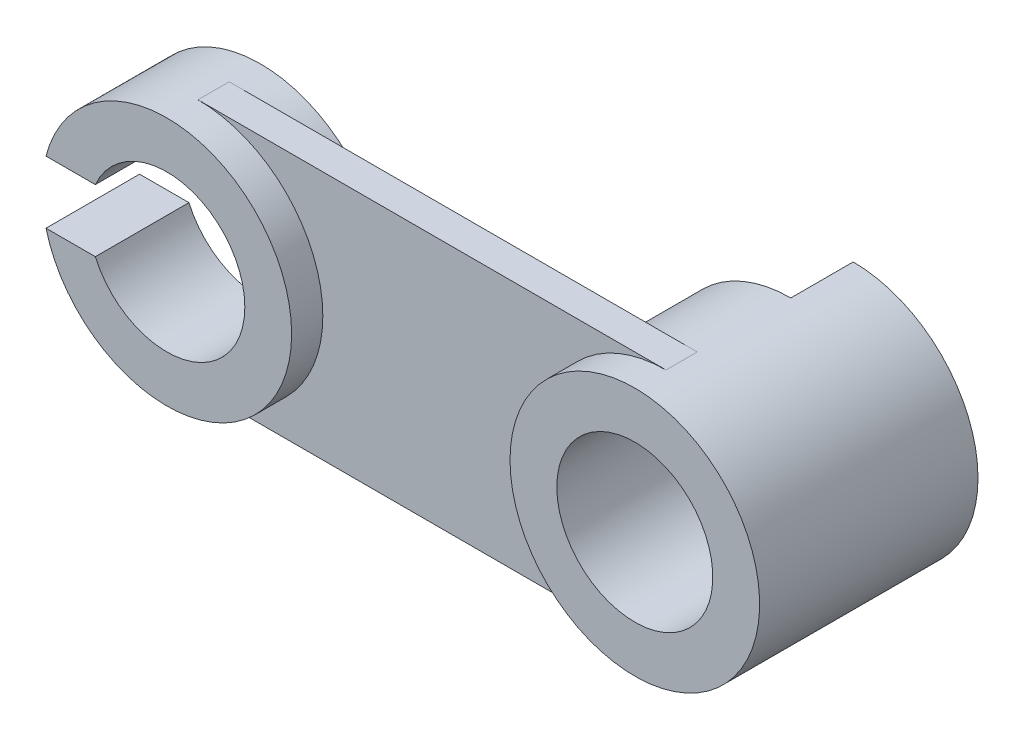
ISO-10303-21;
HEADER;
FILE_DESCRIPTION(('STEP AP214'),'2;1');
FILE_NAME('part.step','',(''),(''),'','','');
FILE_SCHEMA(('AUTOMOTIVE_DESIGN { 1 0 10303 214 1 1 1 1 }'));
ENDSEC;
DATA;
#1=APPLICATION_CONTEXT('core data for automotive mechanical design processes');
#2=APPLICATION_PROTOCOL_DEFINITION('international standard','automotive_design',2000,#1);
#3=PRODUCT_CONTEXT('',#1,'mechanical');
#4=PRODUCT('Part','Part','',(#3));
#5=PRODUCT_RELATED_PRODUCT_CATEGORY('part','',(#4));
#6=PRODUCT_DEFINITION_FORMATION('','',#4);
#7=PRODUCT_DEFINITION_CONTEXT('part definition',#1,'design');
#8=PRODUCT_DEFINITION('design','',#6,#7);
#9=PRODUCT_DEFINITION_SHAPE('','',#8);
#10=(LENGTH_UNIT() NAMED_UNIT(*) SI_UNIT(.MILLI.,.METRE.));
#11=(NAMED_UNIT(*) PLANE_ANGLE_UNIT() SI_UNIT($,.RADIAN.));
#12=(NAMED_UNIT(*) SI_UNIT($,.STERADIAN.) SOLID_ANGLE_UNIT());
#13=UNCERTAINTY_MEASURE_WITH_UNIT(LENGTH_MEASURE(1.E-05),#10,'distance_accuracy_value','');
#14=(GEOMETRIC_REPRESENTATION_CONTEXT(3) GLOBAL_UNCERTAINTY_ASSIGNED_CONTEXT((#13)) GLOBAL_UNIT_ASSIGNED_CONTEXT((#10,
#11,#12)) REPRESENTATION_CONTEXT('',''));
#15=CARTESIAN_POINT('',(0.,0.,0.));
#16=DIRECTION('',(0.,0.,1.));
#17=DIRECTION('',(1.,0.,0.));
#18=AXIS2_PLACEMENT_3D('',#15,#16,#17);
#19=CARTESIAN_POINT('',(17.5,2.5,-15.));
#20=DIRECTION('',(-1.,0.,0.));
#21=DIRECTION('',(0.,0.,1.));
#22=AXIS2_PLACEMENT_3D('',#19,#20,#21);
#23=PLANE('',#22);
#24=DIRECTION('',(0.,0.,-1.));
#25=VECTOR('',#24,1.);
#26=CARTESIAN_POINT('',(17.5,-2.5,-15.));
#27=LINE('',#26,#25);
#28=CARTESIAN_POINT('',(17.5,-2.5,0.));
#29=VERTEX_POINT('',#28);
#30=CARTESIAN_POINT('',(17.5,-2.5,-15.));
#31=VERTEX_POINT('',#30);
#32=EDGE_CURVE('E90',#29,#31,#27,.T.);
#33=ORIENTED_EDGE('',*,*,#32,.T.);
#34=DIRECTION('',(0.,-1.,0.));
#35=VECTOR('',#34,1.);
#36=CARTESIAN_POINT('',(17.5,2.5,-15.));
#37=LINE('',#36,#35);
#38=CARTESIAN_POINT('',(17.5,2.5,-15.));
#39=VERTEX_POINT('',#38);
#40=EDGE_CURVE('E12',#39,#31,#37,.T.);
#41=ORIENTED_EDGE('',*,*,#40,.F.);
#42=DIRECTION('',(0.,0.,-1.));
#43=VECTOR('',#42,1.);
#44=CARTESIAN_POINT('',(17.5,2.5,-15.));
#45=LINE('',#44,#43);
#46=CARTESIAN_POINT('',(17.5,2.5,0.));
#47=VERTEX_POINT('',#46);
#48=EDGE_CURVE('E83',#47,#39,#45,.T.);
#49=ORIENTED_EDGE('',*,*,#48,.F.);
#50=DIRECTION('',(0.,-1.,0.));
#51=VECTOR('',#50,1.);
#52=CARTESIAN_POINT('',(17.5,2.5,0.));
#53=LINE('',#52,#51);
#54=EDGE_CURVE('E91',#47,#29,#53,.T.);
#55=ORIENTED_EDGE('',*,*,#54,.T.);
#56=EDGE_LOOP('',(#33,#41,#49,#55));
#57=FACE_BOUND('',#56,.T.);
#58=ADVANCED_FACE('F43',(#57),#23,.F.);
#59=CARTESIAN_POINT('',(17.5,2.5,-15.));
#60=DIRECTION('',(0.6,0.,0.8));
#61=DIRECTION('',(0.8,0.,-0.6));
#62=AXIS2_PLACEMENT_3D('',#59,#60,#61);
#63=PLANE('',#62);
#64=DIRECTION('',(-0.8,0.,0.6));
#65=VECTOR('',#64,1.);
#66=CARTESIAN_POINT('',(17.5,-2.5,-15.));
#67=LINE('',#66,#65);
#68=CARTESIAN_POINT('',(-2.5,-2.5,0.));
#69=VERTEX_POINT('',#68);
#70=EDGE_CURVE('E71',#31,#69,#67,.T.);
#71=ORIENTED_EDGE('',*,*,#70,.T.);
#72=DIRECTION('',(0.,-1.,0.));
#73=VECTOR('',#72,1.);
#74=CARTESIAN_POINT('',(-2.5,2.5,0.));
#75=LINE('',#74,#73);
#76=CARTESIAN_POINT('',(-2.5,2.5,0.));
#77=VERTEX_POINT('',#76);
#78=EDGE_CURVE('E51',#77,#69,#75,.T.);
#79=ORIENTED_EDGE('',*,*,#78,.F.);
#80=DIRECTION('',(-0.8,0.,0.6));
#81=VECTOR('',#80,1.);
#82=CARTESIAN_POINT('',(17.5,2.5,-15.));
#83=LINE('',#82,#81);
#84=EDGE_CURVE('E79',#39,#77,#83,.T.);
#85=ORIENTED_EDGE('',*,*,#84,.F.);
#86=ORIENTED_EDGE('',*,*,#40,.T.);
#87=EDGE_LOOP('',(#71,#79,#85,#86));
#88=FACE_BOUND('',#87,.T.);
#89=ADVANCED_FACE('F80',(#88),#63,.F.);
#90=CARTESIAN_POINT('',(17.5,2.5,0.));
#91=DIRECTION('',(0.,0.,-1.));
#92=DIRECTION('',(-1.,0.,0.));
#93=AXIS2_PLACEMENT_3D('',#90,#91,#92);
#94=PLANE('',#93);
#95=DIRECTION('',(1.,0.,0.));
#96=VECTOR('',#95,1.);
#97=CARTESIAN_POINT('',(17.5,-2.5,0.));
#98=LINE('',#97,#96);
#99=EDGE_CURVE('E76',#69,#29,#98,.T.);
#100=ORIENTED_EDGE('',*,*,#99,.T.);
#101=ORIENTED_EDGE('',*,*,#54,.F.);
#102=DIRECTION('',(1.,0.,0.));
#103=VECTOR('',#102,1.);
#104=CARTESIAN_POINT('',(17.5,2.5,0.));
#105=LINE('',#104,#103);
#106=EDGE_CURVE('E59',#77,#47,#105,.T.);
#107=ORIENTED_EDGE('',*,*,#106,.F.);
#108=ORIENTED_EDGE('',*,*,#78,.T.);
#109=EDGE_LOOP('',(#100,#101,#107,#108));
#110=FACE_BOUND('',#109,.T.);
#111=ADVANCED_FACE('F98',(#110),#94,.F.);
#112=CARTESIAN_POINT('',(0.,2.5,0.));
#113=DIRECTION('',(0.,-1.,0.));
#114=DIRECTION('',(0.,0.,-1.));
#115=AXIS2_PLACEMENT_3D('',#112,#113,#114);
#116=PLANE('',#115);
#117=ORIENTED_EDGE('',*,*,#48,.T.);
#118=ORIENTED_EDGE('',*,*,#84,.T.);
#119=ORIENTED_EDGE('',*,*,#106,.T.);
#120=EDGE_LOOP('',(#117,#118,#119));
#121=FACE_BOUND('',#120,.T.);
#122=ADVANCED_FACE('F86',(#121),#116,.F.);
#123=CARTESIAN_POINT('',(0.,-2.5,0.));
#124=DIRECTION('',(0.,-1.,0.));
#125=DIRECTION('',(0.,0.,-1.));
#126=AXIS2_PLACEMENT_3D('',#123,#124,#125);
#127=PLANE('',#126);
#128=ORIENTED_EDGE('',*,*,#32,.F.);
#129=ORIENTED_EDGE('',*,*,#99,.F.);
#130=ORIENTED_EDGE('',*,*,#70,.F.);
#131=EDGE_LOOP('',(#128,#129,#130));
#132=FACE_BOUND('',#131,.T.);
#133=ADVANCED_FACE('F99',(#132),#127,.T.);
#134=CLOSED_SHELL('',(#58,#89,#111,#122,#133));
#135=MANIFOLD_SOLID_BREP('B2',#134);
#136=CARTESIAN_POINT('',(-37.5,20.,5.));
#137=DIRECTION('',(0.,-1.,0.));
#138=DIRECTION('',(0.,0.,-1.));
#139=AXIS2_PLACEMENT_3D('',#136,#137,#138);
#140=PLANE('',#139);
#141=DIRECTION('',(-1.,0.,0.));
#142=VECTOR('',#141,1.);
#143=CARTESIAN_POINT('',(-37.5,20.,0.));
#144=LINE('',#143,#142);
#145=CARTESIAN_POINT('',(37.5,20.,0.));
#146=VERTEX_POINT('',#145);
#147=CARTESIAN_POINT('',(-37.5,20.,0.));
#148=VERTEX_POINT('',#147);
#149=EDGE_CURVE('E298',#146,#148,#144,.T.);
#150=ORIENTED_EDGE('',*,*,#149,.T.);
#151=DIRECTION('',(0.,0.,-1.));
#152=VECTOR('',#151,1.);
#153=CARTESIAN_POINT('',(-37.5,20.,5.));
#154=LINE('',#153,#152);
#155=CARTESIAN_POINT('',(-37.5,20.,5.));
#156=VERTEX_POINT('',#155);
#157=EDGE_CURVE('E315',#156,#148,#154,.T.);
#158=ORIENTED_EDGE('',*,*,#157,.F.);
#159=DIRECTION('',(-1.,0.,0.));
#160=VECTOR('',#159,1.);
#161=CARTESIAN_POINT('',(-37.5,20.,5.));
#162=LINE('',#161,#160);
#163=CARTESIAN_POINT('',(37.5,20.,5.));
#164=VERTEX_POINT('',#163);
#165=EDGE_CURVE('E299',#164,#156,#162,.T.);
#166=ORIENTED_EDGE('',*,*,#165,.F.);
#167=DIRECTION('',(0.,0.,-1.));
#168=VECTOR('',#167,1.);
#169=CARTESIAN_POINT('',(37.5,20.,5.));
#170=LINE('',#169,#168);
#171=EDGE_CURVE('E317',#164,#146,#170,.T.);
#172=ORIENTED_EDGE('',*,*,#171,.T.);
#173=EDGE_LOOP('',(#150,#158,#166,#172));
#174=FACE_BOUND('',#173,.T.);
#175=ADVANCED_FACE('F140',(#174),#140,.F.);
#176=CARTESIAN_POINT('',(-37.5,-20.,5.));
#177=DIRECTION('',(0.,1.,0.));
#178=DIRECTION('',(0.,0.,1.));
#179=AXIS2_PLACEMENT_3D('',#176,#177,#178);
#180=PLANE('',#179);
#181=DIRECTION('',(1.,0.,0.));
#182=VECTOR('',#181,1.);
#183=CARTESIAN_POINT('',(-37.5,-20.,0.));
#184=LINE('',#183,#182);
#185=CARTESIAN_POINT('',(-37.5,-20.,0.));
#186=VERTEX_POINT('',#185);
#187=CARTESIAN_POINT('',(37.5,-20.,0.));
#188=VERTEX_POINT('',#187);
#189=EDGE_CURVE('E303',#186,#188,#184,.T.);
#190=ORIENTED_EDGE('',*,*,#189,.T.);
#191=DIRECTION('',(0.,0.,-1.));
#192=VECTOR('',#191,1.);
#193=CARTESIAN_POINT('',(37.5,-20.,5.));
#194=LINE('',#193,#192);
#195=CARTESIAN_POINT('',(37.5,-20.,5.));
#196=VERTEX_POINT('',#195);
#197=EDGE_CURVE('E305',#196,#188,#194,.T.);
#198=ORIENTED_EDGE('',*,*,#197,.F.);
#199=DIRECTION('',(1.,0.,0.));
#200=VECTOR('',#199,1.);
#201=CARTESIAN_POINT('',(-37.5,-20.,5.));
#202=LINE('',#201,#200);
#203=CARTESIAN_POINT('',(-37.5,-20.,5.));
#204=VERTEX_POINT('',#203);
#205=EDGE_CURVE('E302',#204,#196,#202,.T.);
#206=ORIENTED_EDGE('',*,*,#205,.F.);
#207=DIRECTION('',(0.,0.,-1.));
#208=VECTOR('',#207,1.);
#209=CARTESIAN_POINT('',(-37.5,-20.,5.));
#210=LINE('',#209,#208);
#211=EDGE_CURVE('E312',#204,#186,#210,.T.);
#212=ORIENTED_EDGE('',*,*,#211,.T.);
#213=EDGE_LOOP('',(#190,#198,#206,#212));
#214=FACE_BOUND('',#213,.T.);
#215=ADVANCED_FACE('F351',(#214),#180,.F.);
#216=CARTESIAN_POINT('',(0.,0.,5.));
#217=DIRECTION('',(0.,0.,-1.));
#218=DIRECTION('',(-1.,0.,0.));
#219=AXIS2_PLACEMENT_3D('',#216,#217,#218);
#220=PLANE('',#219);
#221=ORIENTED_EDGE('',*,*,#205,.T.);
#222=CARTESIAN_POINT('',(37.5,0.,5.));
#223=DIRECTION('',(0.,0.,-1.));
#224=DIRECTION('',(-1.,0.,0.));
#225=AXIS2_PLACEMENT_3D('',#222,#223,#224);
#226=CIRCLE('',#225,20.);
#227=EDGE_CURVE('E264',#196,#164,#226,.T.);
#228=ORIENTED_EDGE('',*,*,#227,.T.);
#229=ORIENTED_EDGE('',*,*,#165,.T.);
#230=CARTESIAN_POINT('',(-37.5,0.,5.));
#231=DIRECTION('',(0.,0.,-1.));
#232=DIRECTION('',(-1.,0.,0.));
#233=AXIS2_PLACEMENT_3D('',#230,#231,#232);
#234=CIRCLE('',#233,20.);
#235=EDGE_CURVE('E296',#204,#156,#234,.F.);
#236=ORIENTED_EDGE('',*,*,#235,.F.);
#237=EDGE_LOOP('',(#221,#228,#229,#236));
#238=FACE_BOUND('',#237,.T.);
#239=ADVANCED_FACE('F357',(#238),#220,.F.);
#240=CARTESIAN_POINT('',(0.,0.,0.));
#241=DIRECTION('',(0.,0.,-1.));
#242=DIRECTION('',(-1.,0.,0.));
#243=AXIS2_PLACEMENT_3D('',#240,#241,#242);
#244=PLANE('',#243);
#245=CARTESIAN_POINT('',(37.5,0.,0.));
#246=DIRECTION('',(0.,0.,-1.));
#247=DIRECTION('',(-1.,0.,0.));
#248=AXIS2_PLACEMENT_3D('',#245,#246,#247);
#249=CIRCLE('',#248,20.);
#250=EDGE_CURVE('E41',#188,#146,#249,.T.);
#251=ORIENTED_EDGE('',*,*,#250,.F.);
#252=ORIENTED_EDGE('',*,*,#189,.F.);
#253=CARTESIAN_POINT('',(-37.5,0.,0.));
#254=DIRECTION('',(0.,0.,-1.));
#255=DIRECTION('',(-1.,0.,0.));
#256=AXIS2_PLACEMENT_3D('',#253,#254,#255);
#257=CIRCLE('',#256,20.);
#258=EDGE_CURVE('E319',#186,#148,#257,.F.);
#259=ORIENTED_EDGE('',*,*,#258,.T.);
#260=ORIENTED_EDGE('',*,*,#149,.F.);
#261=EDGE_LOOP('',(#251,#252,#259,#260));
#262=FACE_BOUND('',#261,.T.);
#263=ADVANCED_FACE('F364',(#262),#244,.T.);
#264=CARTESIAN_POINT('',(-37.5,0.,10.));
#265=DIRECTION('',(0.,0.,-1.));
#266=DIRECTION('',(-1.,0.,0.));
#267=AXIS2_PLACEMENT_3D('',#264,#265,#266);
#268=CYLINDRICAL_SURFACE('',#267,20.);
#269=CARTESIAN_POINT('',(-37.5,0.,10.));
#270=DIRECTION('',(0.,0.,1.));
#271=DIRECTION('',(1.,0.,0.));
#272=AXIS2_PLACEMENT_3D('',#269,#270,#271);
#273=CIRCLE('',#272,20.);
#274=CARTESIAN_POINT('',(-56.8649167310371,-5.,10.));
#275=VERTEX_POINT('',#274);
#276=CARTESIAN_POINT('',(-56.8649167310371,5.,10.));
#277=VERTEX_POINT('',#276);
#278=EDGE_CURVE('E293',#275,#277,#273,.T.);
#279=ORIENTED_EDGE('',*,*,#278,.F.);
#280=DIRECTION('',(0.,0.,-1.));
#281=VECTOR('',#280,1.);
#282=CARTESIAN_POINT('',(-56.8649167310371,-5.,10.));
#283=LINE('',#282,#281);
#284=CARTESIAN_POINT('',(-56.8649167310371,-5.,-5.));
#285=VERTEX_POINT('',#284);
#286=EDGE_CURVE('E287',#275,#285,#283,.T.);
#287=ORIENTED_EDGE('',*,*,#286,.T.);
#288=CARTESIAN_POINT('',(-37.5,0.,-5.));
#289=DIRECTION('',(0.,0.,1.));
#290=DIRECTION('',(1.,0.,0.));
#291=AXIS2_PLACEMENT_3D('',#288,#289,#290);
#292=CIRCLE('',#291,20.);
#293=CARTESIAN_POINT('',(-56.8649167310371,5.,-5.));
#294=VERTEX_POINT('',#293);
#295=EDGE_CURVE('E290',#285,#294,#292,.T.);
#296=ORIENTED_EDGE('',*,*,#295,.T.);
#297=DIRECTION('',(0.,0.,-1.));
#298=VECTOR('',#297,1.);
#299=CARTESIAN_POINT('',(-56.8649167310371,5.,10.));
#300=LINE('',#299,#298);
#301=EDGE_CURVE('E283',#294,#277,#300,.F.);
#302=ORIENTED_EDGE('',*,*,#301,.T.);
#303=EDGE_LOOP('',(#279,#287,#296,#302));
#304=FACE_BOUND('',#303,.T.);
#305=ORIENTED_EDGE('',*,*,#211,.F.);
#306=ORIENTED_EDGE('',*,*,#235,.T.);
#307=ORIENTED_EDGE('',*,*,#157,.T.);
#308=ORIENTED_EDGE('',*,*,#258,.F.);
#309=EDGE_LOOP('',(#305,#306,#307,#308));
#310=FACE_BOUND('',#309,.T.);
#311=ADVANCED_FACE('F331',(#304,#310),#268,.T.);
#312=CARTESIAN_POINT('',(-37.5,0.,10.));
#313=DIRECTION('',(0.,0.,1.));
#314=DIRECTION('',(1.,0.,0.));
#315=AXIS2_PLACEMENT_3D('',#312,#313,#314);
#316=PLANE('',#315);
#317=DIRECTION('',(1.,0.,0.));
#318=VECTOR('',#317,1.);
#319=CARTESIAN_POINT('',(-57.5,-5.,10.));
#320=LINE('',#319,#318);
#321=CARTESIAN_POINT('',(-48.9564392373896,-5.,10.));
#322=VERTEX_POINT('',#321);
#323=EDGE_CURVE('E271',#275,#322,#320,.T.);
#324=ORIENTED_EDGE('',*,*,#323,.F.);
#325=ORIENTED_EDGE('',*,*,#278,.T.);
#326=DIRECTION('',(-1.,0.,0.));
#327=VECTOR('',#326,1.);
#328=CARTESIAN_POINT('',(-57.5,5.,10.));
#329=LINE('',#328,#327);
#330=CARTESIAN_POINT('',(-48.9564392373896,5.,10.));
#331=VERTEX_POINT('',#330);
#332=EDGE_CURVE('E277',#331,#277,#329,.T.);
#333=ORIENTED_EDGE('',*,*,#332,.F.);
#334=CARTESIAN_POINT('',(-37.5,0.,10.));
#335=DIRECTION('',(0.,0.,1.));
#336=DIRECTION('',(1.,0.,0.));
#337=AXIS2_PLACEMENT_3D('',#334,#335,#336);
#338=CIRCLE('',#337,12.5);
#339=EDGE_CURVE('E266',#322,#331,#338,.T.);
#340=ORIENTED_EDGE('',*,*,#339,.F.);
#341=EDGE_LOOP('',(#324,#325,#333,#340));
#342=FACE_BOUND('',#341,.T.);
#343=ADVANCED_FACE('F335',(#342),#316,.T.);
#344=CARTESIAN_POINT('',(-37.5,0.,-5.));
#345=DIRECTION('',(0.,0.,1.));
#346=DIRECTION('',(1.,0.,0.));
#347=AXIS2_PLACEMENT_3D('',#344,#345,#346);
#348=PLANE('',#347);
#349=ORIENTED_EDGE('',*,*,#295,.F.);
#350=DIRECTION('',(1.,0.,0.));
#351=VECTOR('',#350,1.);
#352=CARTESIAN_POINT('',(-37.5,-5.,-5.));
#353=LINE('',#352,#351);
#354=CARTESIAN_POINT('',(-48.9564392373896,-5.,-5.));
#355=VERTEX_POINT('',#354);
#356=EDGE_CURVE('E147',#285,#355,#353,.T.);
#357=ORIENTED_EDGE('',*,*,#356,.T.);
#358=CARTESIAN_POINT('',(-37.5,0.,-5.));
#359=DIRECTION('',(0.,0.,1.));
#360=DIRECTION('',(1.,0.,0.));
#361=AXIS2_PLACEMENT_3D('',#358,#359,#360);
#362=CIRCLE('',#361,12.5);
#363=CARTESIAN_POINT('',(-48.9564392373896,5.,-5.));
#364=VERTEX_POINT('',#363);
#365=EDGE_CURVE('E267',#355,#364,#362,.T.);
#366=ORIENTED_EDGE('',*,*,#365,.T.);
#367=DIRECTION('',(-1.,0.,0.));
#368=VECTOR('',#367,1.);
#369=CARTESIAN_POINT('',(-57.5,5.,-5.));
#370=LINE('',#369,#368);
#371=EDGE_CURVE('E270',#364,#294,#370,.T.);
#372=ORIENTED_EDGE('',*,*,#371,.T.);
#373=EDGE_LOOP('',(#349,#357,#366,#372));
#374=FACE_BOUND('',#373,.T.);
#375=ADVANCED_FACE('F324',(#374),#348,.F.);
#376=CARTESIAN_POINT('',(-57.5,-5.,-5.));
#377=DIRECTION('',(0.,-1.,0.));
#378=DIRECTION('',(0.,0.,-1.));
#379=AXIS2_PLACEMENT_3D('',#376,#377,#378);
#380=PLANE('',#379);
#381=ORIENTED_EDGE('',*,*,#323,.T.);
#382=DIRECTION('',(0.,0.,1.));
#383=VECTOR('',#382,1.);
#384=CARTESIAN_POINT('',(-48.9564392373896,-5.,-5.));
#385=LINE('',#384,#383);
#386=EDGE_CURVE('E280',#355,#322,#385,.T.);
#387=ORIENTED_EDGE('',*,*,#386,.F.);
#388=ORIENTED_EDGE('',*,*,#356,.F.);
#389=ORIENTED_EDGE('',*,*,#286,.F.);
#390=EDGE_LOOP('',(#381,#387,#388,#389));
#391=FACE_BOUND('',#390,.T.);
#392=ADVANCED_FACE('F327',(#391),#380,.F.);
#393=CARTESIAN_POINT('',(-57.5,5.,-5.));
#394=DIRECTION('',(0.,1.,0.));
#395=DIRECTION('',(0.,0.,1.));
#396=AXIS2_PLACEMENT_3D('',#393,#394,#395);
#397=PLANE('',#396);
#398=ORIENTED_EDGE('',*,*,#371,.F.);
#399=DIRECTION('',(0.,0.,1.));
#400=VECTOR('',#399,1.);
#401=CARTESIAN_POINT('',(-48.9564392373896,5.,-5.));
#402=LINE('',#401,#400);
#403=EDGE_CURVE('E274',#364,#331,#402,.T.);
#404=ORIENTED_EDGE('',*,*,#403,.T.);
#405=ORIENTED_EDGE('',*,*,#332,.T.);
#406=ORIENTED_EDGE('',*,*,#301,.F.);
#407=EDGE_LOOP('',(#398,#404,#405,#406));
#408=FACE_BOUND('',#407,.T.);
#409=ADVANCED_FACE('F341',(#408),#397,.F.);
#410=CARTESIAN_POINT('',(-37.5,0.,-5.));
#411=DIRECTION('',(0.,0.,1.));
#412=DIRECTION('',(1.,0.,0.));
#413=AXIS2_PLACEMENT_3D('',#410,#411,#412);
#414=CYLINDRICAL_SURFACE('',#413,12.5);
#415=ORIENTED_EDGE('',*,*,#339,.T.);
#416=ORIENTED_EDGE('',*,*,#403,.F.);
#417=ORIENTED_EDGE('',*,*,#365,.F.);
#418=ORIENTED_EDGE('',*,*,#386,.T.);
#419=EDGE_LOOP('',(#415,#416,#417,#418));
#420=FACE_BOUND('',#419,.T.);
#421=ADVANCED_FACE('F338',(#420),#414,.F.);
#422=CARTESIAN_POINT('',(37.5,0.,10.));
#423=DIRECTION('',(0.,0.,-1.));
#424=DIRECTION('',(-1.,0.,0.));
#425=AXIS2_PLACEMENT_3D('',#422,#423,#424);
#426=CYLINDRICAL_SURFACE('',#425,20.);
#427=CARTESIAN_POINT('',(37.5,0.,-15.));
#428=DIRECTION('',(0.,0.,-1.));
#429=DIRECTION('',(-1.,0.,0.));
#430=AXIS2_PLACEMENT_3D('',#427,#428,#429);
#431=CIRCLE('',#430,20.);
#432=CARTESIAN_POINT('',(37.5,-20.,-15.));
#433=VERTEX_POINT('',#432);
#434=CARTESIAN_POINT('',(37.5,20.,-15.));
#435=VERTEX_POINT('',#434);
#436=EDGE_CURVE('E158',#433,#435,#431,.T.);
#437=ORIENTED_EDGE('',*,*,#436,.F.);
#438=DIRECTION('',(0.,0.,1.));
#439=VECTOR('',#438,1.);
#440=CARTESIAN_POINT('',(37.5,-20.,-25.));
#441=LINE('',#440,#439);
#442=CARTESIAN_POINT('',(37.5,-20.,-25.));
#443=VERTEX_POINT('',#442);
#444=EDGE_CURVE('E230',#443,#433,#441,.T.);
#445=ORIENTED_EDGE('',*,*,#444,.F.);
#446=CARTESIAN_POINT('',(37.5,0.,-25.));
#447=DIRECTION('',(0.,0.,-1.));
#448=DIRECTION('',(-1.,0.,0.));
#449=AXIS2_PLACEMENT_3D('',#446,#447,#448);
#450=CIRCLE('',#449,20.);
#451=CARTESIAN_POINT('',(37.5,20.,-25.));
#452=VERTEX_POINT('',#451);
#453=EDGE_CURVE('E236',#452,#443,#450,.T.);
#454=ORIENTED_EDGE('',*,*,#453,.F.);
#455=DIRECTION('',(0.,0.,1.));
#456=VECTOR('',#455,1.);
#457=CARTESIAN_POINT('',(37.5,20.,-25.));
#458=LINE('',#457,#456);
#459=EDGE_CURVE('E475',#452,#435,#458,.T.);
#460=ORIENTED_EDGE('',*,*,#459,.T.);
#461=EDGE_LOOP('',(#437,#445,#454,#460));
#462=FACE_BOUND('',#461,.T.);
#463=CARTESIAN_POINT('',(37.5,0.,10.));
#464=DIRECTION('',(0.,0.,-1.));
#465=DIRECTION('',(-1.,0.,0.));
#466=AXIS2_PLACEMENT_3D('',#463,#464,#465);
#467=CIRCLE('',#466,20.);
#468=CARTESIAN_POINT('',(17.5,0.,10.));
#469=VERTEX_POINT('',#468);
#470=EDGE_CURVE('E261',#469,#469,#467,.T.);
#471=ORIENTED_EDGE('',*,*,#470,.T.);
#472=EDGE_LOOP('',(#471));
#473=FACE_BOUND('',#472,.T.);
#474=ORIENTED_EDGE('',*,*,#227,.F.);
#475=ORIENTED_EDGE('',*,*,#197,.T.);
#476=ORIENTED_EDGE('',*,*,#250,.T.);
#477=ORIENTED_EDGE('',*,*,#171,.F.);
#478=EDGE_LOOP('',(#474,#475,#476,#477));
#479=FACE_BOUND('',#478,.T.);
#480=ADVANCED_FACE('F247',(#462,#473,#479),#426,.T.);
#481=CARTESIAN_POINT('',(37.5,0.,10.));
#482=DIRECTION('',(0.,0.,-1.));
#483=DIRECTION('',(-1.,0.,0.));
#484=AXIS2_PLACEMENT_3D('',#481,#482,#483);
#485=PLANE('',#484);
#486=CARTESIAN_POINT('',(37.5,0.,10.));
#487=DIRECTION('',(0.,0.,-1.));
#488=DIRECTION('',(-1.,0.,0.));
#489=AXIS2_PLACEMENT_3D('',#486,#487,#488);
#490=CIRCLE('',#489,12.5);
#491=CARTESIAN_POINT('',(25.,0.,10.));
#492=VERTEX_POINT('',#491);
#493=EDGE_CURVE('E252',#492,#492,#490,.T.);
#494=ORIENTED_EDGE('',*,*,#493,.T.);
#495=EDGE_LOOP('',(#494));
#496=FACE_BOUND('',#495,.T.);
#497=ORIENTED_EDGE('',*,*,#470,.F.);
#498=EDGE_LOOP('',(#497));
#499=FACE_BOUND('',#498,.T.);
#500=ADVANCED_FACE('F410',(#496,#499),#485,.F.);
#501=CARTESIAN_POINT('',(37.5,0.,-15.));
#502=DIRECTION('',(0.,0.,-1.));
#503=DIRECTION('',(-1.,0.,0.));
#504=AXIS2_PLACEMENT_3D('',#501,#502,#503);
#505=PLANE('',#504);
#506=DIRECTION('',(0.,1.,0.));
#507=VECTOR('',#506,1.);
#508=CARTESIAN_POINT('',(37.5,12.5,-15.));
#509=LINE('',#508,#507);
#510=CARTESIAN_POINT('',(37.5,12.5,-15.));
#511=VERTEX_POINT('',#510);
#512=EDGE_CURVE('E245',#511,#435,#509,.T.);
#513=ORIENTED_EDGE('',*,*,#512,.F.);
#514=CARTESIAN_POINT('',(37.5,0.,-15.));
#515=DIRECTION('',(0.,0.,-1.));
#516=DIRECTION('',(-1.,0.,0.));
#517=AXIS2_PLACEMENT_3D('',#514,#515,#516);
#518=CIRCLE('',#517,12.5);
#519=CARTESIAN_POINT('',(37.5,-12.5,-15.));
#520=VERTEX_POINT('',#519);
#521=EDGE_CURVE('E249',#520,#511,#518,.T.);
#522=ORIENTED_EDGE('',*,*,#521,.F.);
#523=DIRECTION('',(0.,1.,0.));
#524=VECTOR('',#523,1.);
#525=CARTESIAN_POINT('',(37.5,-20.,-15.));
#526=LINE('',#525,#524);
#527=EDGE_CURVE('E154',#433,#520,#526,.T.);
#528=ORIENTED_EDGE('',*,*,#527,.F.);
#529=ORIENTED_EDGE('',*,*,#436,.T.);
#530=EDGE_LOOP('',(#513,#522,#528,#529));
#531=FACE_BOUND('',#530,.T.);
#532=ADVANCED_FACE('F418',(#531),#505,.T.);
#533=CARTESIAN_POINT('',(37.5,0.,10.));
#534=DIRECTION('',(0.,0.,-1.));
#535=DIRECTION('',(-1.,0.,0.));
#536=AXIS2_PLACEMENT_3D('',#533,#534,#535);
#537=CYLINDRICAL_SURFACE('',#536,12.5);
#538=ORIENTED_EDGE('',*,*,#493,.F.);
#539=EDGE_LOOP('',(#538));
#540=FACE_BOUND('',#539,.T.);
#541=ORIENTED_EDGE('',*,*,#521,.T.);
#542=DIRECTION('',(0.,0.,1.));
#543=VECTOR('',#542,1.);
#544=CARTESIAN_POINT('',(37.5,12.5,-25.));
#545=LINE('',#544,#543);
#546=CARTESIAN_POINT('',(37.5,12.5,-25.));
#547=VERTEX_POINT('',#546);
#548=EDGE_CURVE('E254',#547,#511,#545,.T.);
#549=ORIENTED_EDGE('',*,*,#548,.F.);
#550=CARTESIAN_POINT('',(37.5,0.,-25.));
#551=DIRECTION('',(0.,0.,1.));
#552=DIRECTION('',(-1.,0.,0.));
#553=AXIS2_PLACEMENT_3D('',#550,#551,#552);
#554=CIRCLE('',#553,12.5);
#555=CARTESIAN_POINT('',(37.5,-12.5,-25.));
#556=VERTEX_POINT('',#555);
#557=EDGE_CURVE('E235',#556,#547,#554,.T.);
#558=ORIENTED_EDGE('',*,*,#557,.F.);
#559=DIRECTION('',(0.,0.,1.));
#560=VECTOR('',#559,1.);
#561=CARTESIAN_POINT('',(37.5,-12.5,-25.));
#562=LINE('',#561,#560);
#563=EDGE_CURVE('E232',#556,#520,#562,.T.);
#564=ORIENTED_EDGE('',*,*,#563,.T.);
#565=EDGE_LOOP('',(#541,#549,#558,#564));
#566=FACE_BOUND('',#565,.T.);
#567=ADVANCED_FACE('F425',(#540,#566),#537,.F.);
#568=CARTESIAN_POINT('',(37.5,-20.,-25.));
#569=DIRECTION('',(1.,0.,0.));
#570=DIRECTION('',(0.,0.,-1.));
#571=AXIS2_PLACEMENT_3D('',#568,#569,#570);
#572=PLANE('',#571);
#573=ORIENTED_EDGE('',*,*,#527,.T.);
#574=ORIENTED_EDGE('',*,*,#563,.F.);
#575=DIRECTION('',(0.,1.,0.));
#576=VECTOR('',#575,1.);
#577=CARTESIAN_POINT('',(37.5,-20.,-25.));
#578=LINE('',#577,#576);
#579=EDGE_CURVE('E226',#443,#556,#578,.T.);
#580=ORIENTED_EDGE('',*,*,#579,.F.);
#581=ORIENTED_EDGE('',*,*,#444,.T.);
#582=EDGE_LOOP('',(#573,#574,#580,#581));
#583=FACE_BOUND('',#582,.T.);
#584=ADVANCED_FACE('F228',(#583),#572,.F.);
#585=CARTESIAN_POINT('',(37.5,12.5,-25.));
#586=DIRECTION('',(1.,0.,0.));
#587=DIRECTION('',(0.,0.,-1.));
#588=AXIS2_PLACEMENT_3D('',#585,#586,#587);
#589=PLANE('',#588);
#590=ORIENTED_EDGE('',*,*,#512,.T.);
#591=ORIENTED_EDGE('',*,*,#459,.F.);
#592=DIRECTION('',(0.,1.,0.));
#593=VECTOR('',#592,1.);
#594=CARTESIAN_POINT('',(37.5,12.5,-25.));
#595=LINE('',#594,#593);
#596=EDGE_CURVE('E241',#547,#452,#595,.T.);
#597=ORIENTED_EDGE('',*,*,#596,.F.);
#598=ORIENTED_EDGE('',*,*,#548,.T.);
#599=EDGE_LOOP('',(#590,#591,#597,#598));
#600=FACE_BOUND('',#599,.T.);
#601=ADVANCED_FACE('F439',(#600),#589,.F.);
#602=CARTESIAN_POINT('',(37.5,0.,-25.));
#603=DIRECTION('',(0.,0.,-1.));
#604=DIRECTION('',(-1.,0.,0.));
#605=AXIS2_PLACEMENT_3D('',#602,#603,#604);
#606=PLANE('',#605);
#607=ORIENTED_EDGE('',*,*,#453,.T.);
#608=ORIENTED_EDGE('',*,*,#579,.T.);
#609=ORIENTED_EDGE('',*,*,#557,.T.);
#610=ORIENTED_EDGE('',*,*,#596,.T.);
#611=EDGE_LOOP('',(#607,#608,#609,#610));
#612=FACE_BOUND('',#611,.T.);
#613=ADVANCED_FACE('F239',(#612),#606,.T.);
#614=CLOSED_SHELL('',(#175,#215,#239,#263,#311,#343,#375,#392,#409,#421,#480,#500,#532,#567,
#584,#601,#613));
#615=MANIFOLD_SOLID_BREP('B6',#614);
#616=ADVANCED_BREP_SHAPE_REPRESENTATION('',(#18,#135,#615),#14);
#617=SHAPE_DEFINITION_REPRESENTATION(#9,#616);
ENDSEC;
END-ISO-10303-21;
